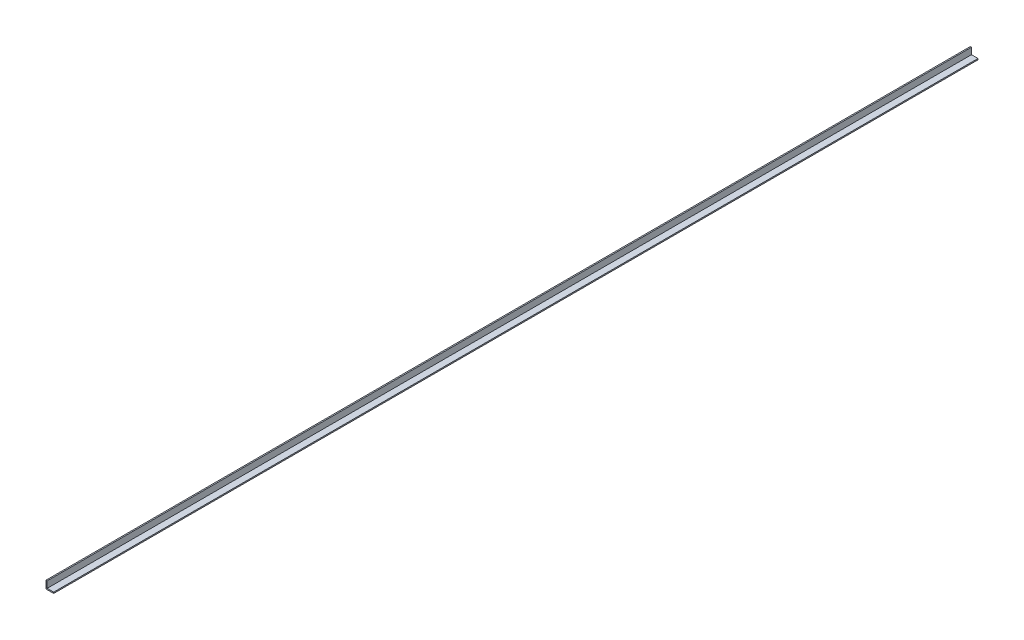
ISO-10303-21;
HEADER;
FILE_DESCRIPTION(('STEP AP214'),'2;1');
FILE_NAME('part.step','',(''),(''),'','','');
FILE_SCHEMA(('AUTOMOTIVE_DESIGN { 1 0 10303 214 1 1 1 1 }'));
ENDSEC;
DATA;
#1=APPLICATION_CONTEXT('core data for automotive mechanical design processes');
#2=APPLICATION_PROTOCOL_DEFINITION('international standard','automotive_design',2000,#1);
#3=PRODUCT_CONTEXT('',#1,'mechanical');
#4=PRODUCT('Part','Part','',(#3));
#5=PRODUCT_RELATED_PRODUCT_CATEGORY('part','',(#4));
#6=PRODUCT_DEFINITION_FORMATION('','',#4);
#7=PRODUCT_DEFINITION_CONTEXT('part definition',#1,'design');
#8=PRODUCT_DEFINITION('design','',#6,#7);
#9=PRODUCT_DEFINITION_SHAPE('','',#8);
#10=(LENGTH_UNIT() NAMED_UNIT(*) SI_UNIT(.MILLI.,.METRE.));
#11=(NAMED_UNIT(*) PLANE_ANGLE_UNIT() SI_UNIT($,.RADIAN.));
#12=(NAMED_UNIT(*) SI_UNIT($,.STERADIAN.) SOLID_ANGLE_UNIT());
#13=UNCERTAINTY_MEASURE_WITH_UNIT(LENGTH_MEASURE(1.E-05),#10,'distance_accuracy_value','');
#14=(GEOMETRIC_REPRESENTATION_CONTEXT(3) GLOBAL_UNCERTAINTY_ASSIGNED_CONTEXT((#13)) GLOBAL_UNIT_ASSIGNED_CONTEXT((#10,
#11,#12)) REPRESENTATION_CONTEXT('',''));
#15=CARTESIAN_POINT('',(0.,0.,0.));
#16=DIRECTION('',(0.,0.,1.));
#17=DIRECTION('',(1.,0.,0.));
#18=AXIS2_PLACEMENT_3D('',#15,#16,#17);
#19=CARTESIAN_POINT('',(7.94,50.8,-6100.));
#20=DIRECTION('',(0.,1.,0.));
#21=DIRECTION('',(0.,0.,1.));
#22=AXIS2_PLACEMENT_3D('',#19,#20,#21);
#23=PLANE('',#22);
#24=DIRECTION('',(-1.,0.,0.));
#25=VECTOR('',#24,1.);
#26=CARTESIAN_POINT('',(7.94,50.8,0.));
#27=LINE('',#26,#25);
#28=CARTESIAN_POINT('',(7.94,50.8,0.));
#29=VERTEX_POINT('',#28);
#30=CARTESIAN_POINT('',(0.,50.8,0.));
#31=VERTEX_POINT('',#30);
#32=EDGE_CURVE('E118',#29,#31,#27,.T.);
#33=ORIENTED_EDGE('',*,*,#32,.F.);
#34=DIRECTION('',(0.,0.,1.));
#35=VECTOR('',#34,1.);
#36=CARTESIAN_POINT('',(7.94,50.8,-6100.));
#37=LINE('',#36,#35);
#38=CARTESIAN_POINT('',(7.94,50.8,-6100.));
#39=VERTEX_POINT('',#38);
#40=EDGE_CURVE('E11',#39,#29,#37,.T.);
#41=ORIENTED_EDGE('',*,*,#40,.F.);
#42=DIRECTION('',(-1.,0.,0.));
#43=VECTOR('',#42,1.);
#44=CARTESIAN_POINT('',(7.94,50.8,-6100.));
#45=LINE('',#44,#43);
#46=CARTESIAN_POINT('',(0.,50.8,-6100.));
#47=VERTEX_POINT('',#46);
#48=EDGE_CURVE('E132',#39,#47,#45,.T.);
#49=ORIENTED_EDGE('',*,*,#48,.T.);
#50=DIRECTION('',(0.,0.,1.));
#51=VECTOR('',#50,1.);
#52=CARTESIAN_POINT('',(0.,50.8,-6100.));
#53=LINE('',#52,#51);
#54=EDGE_CURVE('E36',#47,#31,#53,.T.);
#55=ORIENTED_EDGE('',*,*,#54,.T.);
#56=EDGE_LOOP('',(#33,#41,#49,#55));
#57=FACE_BOUND('',#56,.T.);
#58=ADVANCED_FACE('F33',(#57),#23,.T.);
#59=CARTESIAN_POINT('',(7.94,7.94,-6100.));
#60=DIRECTION('',(1.,0.,0.));
#61=DIRECTION('',(0.,1.,0.));
#62=AXIS2_PLACEMENT_3D('',#59,#60,#61);
#63=PLANE('',#62);
#64=DIRECTION('',(0.,1.,0.));
#65=VECTOR('',#64,1.);
#66=CARTESIAN_POINT('',(7.94,7.94,0.));
#67=LINE('',#66,#65);
#68=CARTESIAN_POINT('',(7.94,7.94,0.));
#69=VERTEX_POINT('',#68);
#70=EDGE_CURVE('E130',#69,#29,#67,.T.);
#71=ORIENTED_EDGE('',*,*,#70,.F.);
#72=DIRECTION('',(0.,0.,1.));
#73=VECTOR('',#72,1.);
#74=CARTESIAN_POINT('',(7.94,7.94,-6100.));
#75=LINE('',#74,#73);
#76=CARTESIAN_POINT('',(7.94,7.94,-6100.));
#77=VERTEX_POINT('',#76);
#78=EDGE_CURVE('E42',#77,#69,#75,.T.);
#79=ORIENTED_EDGE('',*,*,#78,.F.);
#80=DIRECTION('',(0.,1.,0.));
#81=VECTOR('',#80,1.);
#82=CARTESIAN_POINT('',(7.94,7.94,-6100.));
#83=LINE('',#82,#81);
#84=EDGE_CURVE('E108',#77,#39,#83,.T.);
#85=ORIENTED_EDGE('',*,*,#84,.T.);
#86=ORIENTED_EDGE('',*,*,#40,.T.);
#87=EDGE_LOOP('',(#71,#79,#85,#86));
#88=FACE_BOUND('',#87,.T.);
#89=ADVANCED_FACE('F140',(#88),#63,.T.);
#90=CARTESIAN_POINT('',(50.8,7.94,-6100.));
#91=DIRECTION('',(0.,1.,0.));
#92=DIRECTION('',(-1.,0.,0.));
#93=AXIS2_PLACEMENT_3D('',#90,#91,#92);
#94=PLANE('',#93);
#95=DIRECTION('',(-1.,0.,0.));
#96=VECTOR('',#95,1.);
#97=CARTESIAN_POINT('',(50.8,7.94,0.));
#98=LINE('',#97,#96);
#99=CARTESIAN_POINT('',(50.8,7.94,0.));
#100=VERTEX_POINT('',#99);
#101=EDGE_CURVE('E95',#100,#69,#98,.T.);
#102=ORIENTED_EDGE('',*,*,#101,.F.);
#103=DIRECTION('',(0.,0.,1.));
#104=VECTOR('',#103,1.);
#105=CARTESIAN_POINT('',(50.8,7.94,-6100.));
#106=LINE('',#105,#104);
#107=CARTESIAN_POINT('',(50.8,7.94,-6100.));
#108=VERTEX_POINT('',#107);
#109=EDGE_CURVE('E90',#108,#100,#106,.T.);
#110=ORIENTED_EDGE('',*,*,#109,.F.);
#111=DIRECTION('',(-1.,0.,0.));
#112=VECTOR('',#111,1.);
#113=CARTESIAN_POINT('',(50.8,7.94,-6100.));
#114=LINE('',#113,#112);
#115=EDGE_CURVE('E93',#108,#77,#114,.T.);
#116=ORIENTED_EDGE('',*,*,#115,.T.);
#117=ORIENTED_EDGE('',*,*,#78,.T.);
#118=EDGE_LOOP('',(#102,#110,#116,#117));
#119=FACE_BOUND('',#118,.T.);
#120=ADVANCED_FACE('F92',(#119),#94,.T.);
#121=CARTESIAN_POINT('',(50.8,0.,-6100.));
#122=DIRECTION('',(1.,0.,0.));
#123=DIRECTION('',(0.,0.,-1.));
#124=AXIS2_PLACEMENT_3D('',#121,#122,#123);
#125=PLANE('',#124);
#126=DIRECTION('',(0.,1.,0.));
#127=VECTOR('',#126,1.);
#128=CARTESIAN_POINT('',(50.8,0.,0.));
#129=LINE('',#128,#127);
#130=CARTESIAN_POINT('',(50.8,0.,0.));
#131=VERTEX_POINT('',#130);
#132=EDGE_CURVE('E127',#131,#100,#129,.T.);
#133=ORIENTED_EDGE('',*,*,#132,.F.);
#134=DIRECTION('',(0.,0.,1.));
#135=VECTOR('',#134,1.);
#136=CARTESIAN_POINT('',(50.8,0.,-6100.));
#137=LINE('',#136,#135);
#138=CARTESIAN_POINT('',(50.8,0.,-6100.));
#139=VERTEX_POINT('',#138);
#140=EDGE_CURVE('E100',#139,#131,#137,.T.);
#141=ORIENTED_EDGE('',*,*,#140,.F.);
#142=DIRECTION('',(0.,1.,0.));
#143=VECTOR('',#142,1.);
#144=CARTESIAN_POINT('',(50.8,0.,-6100.));
#145=LINE('',#144,#143);
#146=EDGE_CURVE('E106',#139,#108,#145,.T.);
#147=ORIENTED_EDGE('',*,*,#146,.T.);
#148=ORIENTED_EDGE('',*,*,#109,.T.);
#149=EDGE_LOOP('',(#133,#141,#147,#148));
#150=FACE_BOUND('',#149,.T.);
#151=ADVANCED_FACE('F110',(#150),#125,.T.);
#152=CARTESIAN_POINT('',(0.,0.,-6100.));
#153=DIRECTION('',(0.,-1.,0.));
#154=DIRECTION('',(0.,0.,-1.));
#155=AXIS2_PLACEMENT_3D('',#152,#153,#154);
#156=PLANE('',#155);
#157=DIRECTION('',(1.,0.,0.));
#158=VECTOR('',#157,1.);
#159=CARTESIAN_POINT('',(0.,0.,0.));
#160=LINE('',#159,#158);
#161=CARTESIAN_POINT('',(0.,0.,0.));
#162=VERTEX_POINT('',#161);
#163=EDGE_CURVE('E124',#162,#131,#160,.T.);
#164=ORIENTED_EDGE('',*,*,#163,.F.);
#165=DIRECTION('',(0.,0.,1.));
#166=VECTOR('',#165,1.);
#167=CARTESIAN_POINT('',(0.,0.,-6100.));
#168=LINE('',#167,#166);
#169=CARTESIAN_POINT('',(0.,0.,-6100.));
#170=VERTEX_POINT('',#169);
#171=EDGE_CURVE('E135',#170,#162,#168,.T.);
#172=ORIENTED_EDGE('',*,*,#171,.F.);
#173=DIRECTION('',(1.,0.,0.));
#174=VECTOR('',#173,1.);
#175=CARTESIAN_POINT('',(0.,0.,-6100.));
#176=LINE('',#175,#174);
#177=EDGE_CURVE('E111',#170,#139,#176,.T.);
#178=ORIENTED_EDGE('',*,*,#177,.T.);
#179=ORIENTED_EDGE('',*,*,#140,.T.);
#180=EDGE_LOOP('',(#164,#172,#178,#179));
#181=FACE_BOUND('',#180,.T.);
#182=ADVANCED_FACE('F153',(#181),#156,.T.);
#183=CARTESIAN_POINT('',(0.,50.8,-6100.));
#184=DIRECTION('',(-1.,0.,0.));
#185=DIRECTION('',(0.,-1.,0.));
#186=AXIS2_PLACEMENT_3D('',#183,#184,#185);
#187=PLANE('',#186);
#188=DIRECTION('',(0.,-1.,0.));
#189=VECTOR('',#188,1.);
#190=CARTESIAN_POINT('',(0.,50.8,0.));
#191=LINE('',#190,#189);
#192=EDGE_CURVE('E121',#31,#162,#191,.T.);
#193=ORIENTED_EDGE('',*,*,#192,.F.);
#194=ORIENTED_EDGE('',*,*,#54,.F.);
#195=DIRECTION('',(0.,-1.,0.));
#196=VECTOR('',#195,1.);
#197=CARTESIAN_POINT('',(0.,50.8,-6100.));
#198=LINE('',#197,#196);
#199=EDGE_CURVE('E113',#47,#170,#198,.T.);
#200=ORIENTED_EDGE('',*,*,#199,.T.);
#201=ORIENTED_EDGE('',*,*,#171,.T.);
#202=EDGE_LOOP('',(#193,#194,#200,#201));
#203=FACE_BOUND('',#202,.T.);
#204=ADVANCED_FACE('F137',(#203),#187,.T.);
#205=CARTESIAN_POINT('',(0.,0.,-6100.));
#206=DIRECTION('',(0.,0.,1.));
#207=DIRECTION('',(1.,0.,0.));
#208=AXIS2_PLACEMENT_3D('',#205,#206,#207);
#209=PLANE('',#208);
#210=ORIENTED_EDGE('',*,*,#48,.F.);
#211=ORIENTED_EDGE('',*,*,#84,.F.);
#212=ORIENTED_EDGE('',*,*,#115,.F.);
#213=ORIENTED_EDGE('',*,*,#146,.F.);
#214=ORIENTED_EDGE('',*,*,#177,.F.);
#215=ORIENTED_EDGE('',*,*,#199,.F.);
#216=EDGE_LOOP('',(#210,#211,#212,#213,#214,#215));
#217=FACE_BOUND('',#216,.T.);
#218=ADVANCED_FACE('F104',(#217),#209,.F.);
#219=CARTESIAN_POINT('',(0.,0.,0.));
#220=DIRECTION('',(0.,0.,1.));
#221=DIRECTION('',(1.,0.,0.));
#222=AXIS2_PLACEMENT_3D('',#219,#220,#221);
#223=PLANE('',#222);
#224=ORIENTED_EDGE('',*,*,#32,.T.);
#225=ORIENTED_EDGE('',*,*,#192,.T.);
#226=ORIENTED_EDGE('',*,*,#163,.T.);
#227=ORIENTED_EDGE('',*,*,#132,.T.);
#228=ORIENTED_EDGE('',*,*,#101,.T.);
#229=ORIENTED_EDGE('',*,*,#70,.T.);
#230=EDGE_LOOP('',(#224,#225,#226,#227,#228,#229));
#231=FACE_BOUND('',#230,.T.);
#232=ADVANCED_FACE('F139',(#231),#223,.T.);
#233=CLOSED_SHELL('',(#58,#89,#120,#151,#182,#204,#218,#232));
#234=MANIFOLD_SOLID_BREP('B2',#233);
#235=ADVANCED_BREP_SHAPE_REPRESENTATION('',(#18,#234),#14);
#236=SHAPE_DEFINITION_REPRESENTATION(#9,#235);
ENDSEC;
END-ISO-10303-21;
